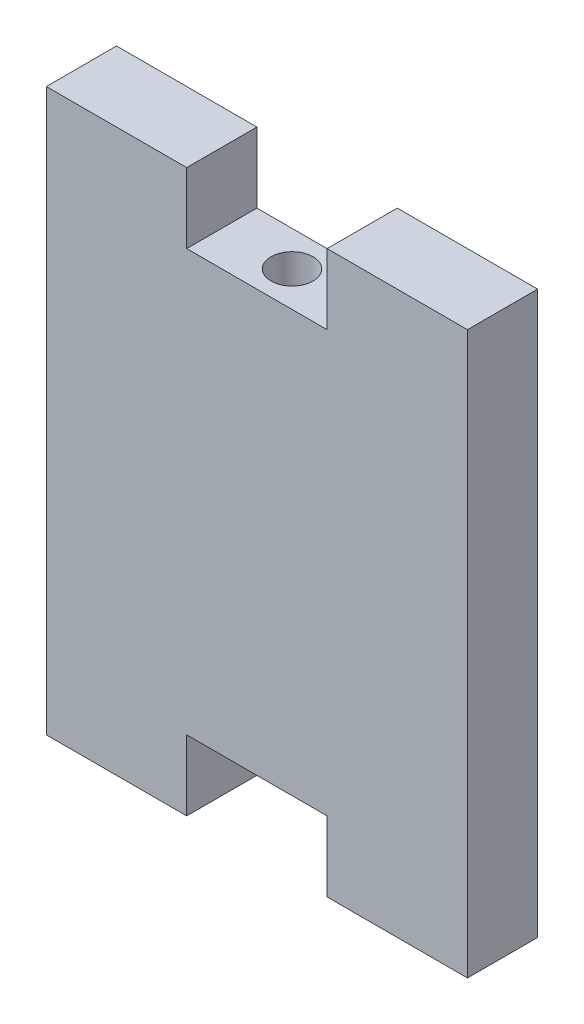
ISO-10303-21;
HEADER;
FILE_DESCRIPTION(('STEP AP214'),'2;1');
FILE_NAME('part.step','',(''),(''),'','','');
FILE_SCHEMA(('AUTOMOTIVE_DESIGN { 1 0 10303 214 1 1 1 1 }'));
ENDSEC;
DATA;
#1=APPLICATION_CONTEXT('core data for automotive mechanical design processes');
#2=APPLICATION_PROTOCOL_DEFINITION('international standard','automotive_design',2000,#1);
#3=PRODUCT_CONTEXT('',#1,'mechanical');
#4=PRODUCT('Part','Part','',(#3));
#5=PRODUCT_RELATED_PRODUCT_CATEGORY('part','',(#4));
#6=PRODUCT_DEFINITION_FORMATION('','',#4);
#7=PRODUCT_DEFINITION_CONTEXT('part definition',#1,'design');
#8=PRODUCT_DEFINITION('design','',#6,#7);
#9=PRODUCT_DEFINITION_SHAPE('','',#8);
#10=(LENGTH_UNIT() NAMED_UNIT(*) SI_UNIT(.MILLI.,.METRE.));
#11=(NAMED_UNIT(*) PLANE_ANGLE_UNIT() SI_UNIT($,.RADIAN.));
#12=(NAMED_UNIT(*) SI_UNIT($,.STERADIAN.) SOLID_ANGLE_UNIT());
#13=UNCERTAINTY_MEASURE_WITH_UNIT(LENGTH_MEASURE(1.E-05),#10,'distance_accuracy_value','');
#14=(GEOMETRIC_REPRESENTATION_CONTEXT(3) GLOBAL_UNCERTAINTY_ASSIGNED_CONTEXT((#13)) GLOBAL_UNIT_ASSIGNED_CONTEXT((#10,
#11,#12)) REPRESENTATION_CONTEXT('',''));
#15=CARTESIAN_POINT('',(0.,0.,0.));
#16=DIRECTION('',(0.,0.,1.));
#17=DIRECTION('',(1.,0.,0.));
#18=AXIS2_PLACEMENT_3D('',#15,#16,#17);
#19=CARTESIAN_POINT('',(30.,-40.,10.));
#20=DIRECTION('',(-1.,0.,0.));
#21=DIRECTION('',(0.,0.,1.));
#22=AXIS2_PLACEMENT_3D('',#19,#20,#21);
#23=PLANE('',#22);
#24=DIRECTION('',(0.,1.,0.));
#25=VECTOR('',#24,1.);
#26=CARTESIAN_POINT('',(30.,-40.,0.));
#27=LINE('',#26,#25);
#28=CARTESIAN_POINT('',(30.,-40.,0.));
#29=VERTEX_POINT('',#28);
#30=CARTESIAN_POINT('',(30.,40.,0.));
#31=VERTEX_POINT('',#30);
#32=EDGE_CURVE('E164',#29,#31,#27,.T.);
#33=ORIENTED_EDGE('',*,*,#32,.T.);
#34=DIRECTION('',(0.,0.,-1.));
#35=VECTOR('',#34,1.);
#36=CARTESIAN_POINT('',(30.,40.,10.));
#37=LINE('',#36,#35);
#38=CARTESIAN_POINT('',(30.,40.,10.));
#39=VERTEX_POINT('',#38);
#40=EDGE_CURVE('E11',#39,#31,#37,.T.);
#41=ORIENTED_EDGE('',*,*,#40,.F.);
#42=DIRECTION('',(0.,1.,0.));
#43=VECTOR('',#42,1.);
#44=CARTESIAN_POINT('',(30.,-40.,10.));
#45=LINE('',#44,#43);
#46=CARTESIAN_POINT('',(30.,-40.,10.));
#47=VERTEX_POINT('',#46);
#48=EDGE_CURVE('E198',#47,#39,#45,.T.);
#49=ORIENTED_EDGE('',*,*,#48,.F.);
#50=DIRECTION('',(0.,0.,-1.));
#51=VECTOR('',#50,1.);
#52=CARTESIAN_POINT('',(30.,-40.,10.));
#53=LINE('',#52,#51);
#54=EDGE_CURVE('E160',#47,#29,#53,.T.);
#55=ORIENTED_EDGE('',*,*,#54,.T.);
#56=EDGE_LOOP('',(#33,#41,#49,#55));
#57=FACE_BOUND('',#56,.T.);
#58=ADVANCED_FACE('F38',(#57),#23,.F.);
#59=CARTESIAN_POINT('',(10.,40.,10.));
#60=DIRECTION('',(0.,-1.,0.));
#61=DIRECTION('',(0.,0.,-1.));
#62=AXIS2_PLACEMENT_3D('',#59,#60,#61);
#63=PLANE('',#62);
#64=DIRECTION('',(-1.,0.,0.));
#65=VECTOR('',#64,1.);
#66=CARTESIAN_POINT('',(10.,40.,0.));
#67=LINE('',#66,#65);
#68=CARTESIAN_POINT('',(10.,40.,0.));
#69=VERTEX_POINT('',#68);
#70=EDGE_CURVE('E168',#31,#69,#67,.T.);
#71=ORIENTED_EDGE('',*,*,#70,.T.);
#72=DIRECTION('',(0.,0.,-1.));
#73=VECTOR('',#72,1.);
#74=CARTESIAN_POINT('',(10.,40.,10.));
#75=LINE('',#74,#73);
#76=CARTESIAN_POINT('',(10.,40.,10.));
#77=VERTEX_POINT('',#76);
#78=EDGE_CURVE('E48',#77,#69,#75,.T.);
#79=ORIENTED_EDGE('',*,*,#78,.F.);
#80=DIRECTION('',(-1.,0.,0.));
#81=VECTOR('',#80,1.);
#82=CARTESIAN_POINT('',(10.,40.,10.));
#83=LINE('',#82,#81);
#84=EDGE_CURVE('E111',#39,#77,#83,.T.);
#85=ORIENTED_EDGE('',*,*,#84,.F.);
#86=ORIENTED_EDGE('',*,*,#40,.T.);
#87=EDGE_LOOP('',(#71,#79,#85,#86));
#88=FACE_BOUND('',#87,.T.);
#89=ADVANCED_FACE('F293',(#88),#63,.F.);
#90=CARTESIAN_POINT('',(10.,40.,10.));
#91=DIRECTION('',(1.,0.,0.));
#92=DIRECTION('',(0.,0.,-1.));
#93=AXIS2_PLACEMENT_3D('',#90,#91,#92);
#94=PLANE('',#93);
#95=DIRECTION('',(0.,-1.,0.));
#96=VECTOR('',#95,1.);
#97=CARTESIAN_POINT('',(10.,40.,0.));
#98=LINE('',#97,#96);
#99=CARTESIAN_POINT('',(10.,30.,0.));
#100=VERTEX_POINT('',#99);
#101=EDGE_CURVE('E171',#69,#100,#98,.T.);
#102=ORIENTED_EDGE('',*,*,#101,.T.);
#103=DIRECTION('',(0.,0.,-1.));
#104=VECTOR('',#103,1.);
#105=CARTESIAN_POINT('',(10.,30.,10.));
#106=LINE('',#105,#104);
#107=CARTESIAN_POINT('',(10.,30.,10.));
#108=VERTEX_POINT('',#107);
#109=EDGE_CURVE('E225',#108,#100,#106,.T.);
#110=ORIENTED_EDGE('',*,*,#109,.F.);
#111=DIRECTION('',(0.,-1.,0.));
#112=VECTOR('',#111,1.);
#113=CARTESIAN_POINT('',(10.,40.,10.));
#114=LINE('',#113,#112);
#115=EDGE_CURVE('E236',#77,#108,#114,.T.);
#116=ORIENTED_EDGE('',*,*,#115,.F.);
#117=ORIENTED_EDGE('',*,*,#78,.T.);
#118=EDGE_LOOP('',(#102,#110,#116,#117));
#119=FACE_BOUND('',#118,.T.);
#120=ADVANCED_FACE('F234',(#119),#94,.F.);
#121=CARTESIAN_POINT('',(-10.,30.,10.));
#122=DIRECTION('',(0.,-1.,0.));
#123=DIRECTION('',(0.,0.,-1.));
#124=AXIS2_PLACEMENT_3D('',#121,#122,#123);
#125=PLANE('',#124);
#126=CARTESIAN_POINT('',(0.,30.,5.));
#127=DIRECTION('',(0.,1.,0.));
#128=DIRECTION('',(0.,0.,1.));
#129=AXIS2_PLACEMENT_3D('',#126,#127,#128);
#130=CIRCLE('',#129,3.);
#131=CARTESIAN_POINT('',(0.,30.,8.));
#132=VERTEX_POINT('',#131);
#133=EDGE_CURVE('E328',#132,#132,#130,.T.);
#134=ORIENTED_EDGE('',*,*,#133,.F.);
#135=EDGE_LOOP('',(#134));
#136=FACE_BOUND('',#135,.T.);
#137=DIRECTION('',(-1.,0.,0.));
#138=VECTOR('',#137,1.);
#139=CARTESIAN_POINT('',(-10.,30.,0.));
#140=LINE('',#139,#138);
#141=CARTESIAN_POINT('',(-10.,30.,0.));
#142=VERTEX_POINT('',#141);
#143=EDGE_CURVE('E174',#100,#142,#140,.T.);
#144=ORIENTED_EDGE('',*,*,#143,.T.);
#145=DIRECTION('',(0.,0.,-1.));
#146=VECTOR('',#145,1.);
#147=CARTESIAN_POINT('',(-10.,30.,10.));
#148=LINE('',#147,#146);
#149=CARTESIAN_POINT('',(-10.,30.,10.));
#150=VERTEX_POINT('',#149);
#151=EDGE_CURVE('E221',#150,#142,#148,.T.);
#152=ORIENTED_EDGE('',*,*,#151,.F.);
#153=DIRECTION('',(-1.,0.,0.));
#154=VECTOR('',#153,1.);
#155=CARTESIAN_POINT('',(-10.,30.,10.));
#156=LINE('',#155,#154);
#157=EDGE_CURVE('E255',#108,#150,#156,.T.);
#158=ORIENTED_EDGE('',*,*,#157,.F.);
#159=ORIENTED_EDGE('',*,*,#109,.T.);
#160=EDGE_LOOP('',(#144,#152,#158,#159));
#161=FACE_BOUND('',#160,.T.);
#162=ADVANCED_FACE('F245',(#136,#161),#125,.F.);
#163=CARTESIAN_POINT('',(-10.,40.,10.));
#164=DIRECTION('',(-1.,0.,0.));
#165=DIRECTION('',(0.,-1.,0.));
#166=AXIS2_PLACEMENT_3D('',#163,#164,#165);
#167=PLANE('',#166);
#168=DIRECTION('',(0.,1.,0.));
#169=VECTOR('',#168,1.);
#170=CARTESIAN_POINT('',(-10.,40.,0.));
#171=LINE('',#170,#169);
#172=CARTESIAN_POINT('',(-10.,40.,0.));
#173=VERTEX_POINT('',#172);
#174=EDGE_CURVE('E177',#142,#173,#171,.T.);
#175=ORIENTED_EDGE('',*,*,#174,.T.);
#176=DIRECTION('',(0.,0.,-1.));
#177=VECTOR('',#176,1.);
#178=CARTESIAN_POINT('',(-10.,40.,10.));
#179=LINE('',#178,#177);
#180=CARTESIAN_POINT('',(-10.,40.,10.));
#181=VERTEX_POINT('',#180);
#182=EDGE_CURVE('E217',#181,#173,#179,.T.);
#183=ORIENTED_EDGE('',*,*,#182,.F.);
#184=DIRECTION('',(0.,1.,0.));
#185=VECTOR('',#184,1.);
#186=CARTESIAN_POINT('',(-10.,40.,10.));
#187=LINE('',#186,#185);
#188=EDGE_CURVE('E251',#150,#181,#187,.T.);
#189=ORIENTED_EDGE('',*,*,#188,.F.);
#190=ORIENTED_EDGE('',*,*,#151,.T.);
#191=EDGE_LOOP('',(#175,#183,#189,#190));
#192=FACE_BOUND('',#191,.T.);
#193=ADVANCED_FACE('F249',(#192),#167,.F.);
#194=CARTESIAN_POINT('',(-30.,40.,10.));
#195=DIRECTION('',(0.,-1.,0.));
#196=DIRECTION('',(0.,0.,-1.));
#197=AXIS2_PLACEMENT_3D('',#194,#195,#196);
#198=PLANE('',#197);
#199=DIRECTION('',(-1.,0.,0.));
#200=VECTOR('',#199,1.);
#201=CARTESIAN_POINT('',(-30.,40.,0.));
#202=LINE('',#201,#200);
#203=CARTESIAN_POINT('',(-30.,40.,0.));
#204=VERTEX_POINT('',#203);
#205=EDGE_CURVE('E180',#173,#204,#202,.T.);
#206=ORIENTED_EDGE('',*,*,#205,.T.);
#207=DIRECTION('',(0.,0.,-1.));
#208=VECTOR('',#207,1.);
#209=CARTESIAN_POINT('',(-30.,40.,10.));
#210=LINE('',#209,#208);
#211=CARTESIAN_POINT('',(-30.,40.,10.));
#212=VERTEX_POINT('',#211);
#213=EDGE_CURVE('E213',#212,#204,#210,.T.);
#214=ORIENTED_EDGE('',*,*,#213,.F.);
#215=DIRECTION('',(-1.,0.,0.));
#216=VECTOR('',#215,1.);
#217=CARTESIAN_POINT('',(-30.,40.,10.));
#218=LINE('',#217,#216);
#219=EDGE_CURVE('E254',#181,#212,#218,.T.);
#220=ORIENTED_EDGE('',*,*,#219,.F.);
#221=ORIENTED_EDGE('',*,*,#182,.T.);
#222=EDGE_LOOP('',(#206,#214,#220,#221));
#223=FACE_BOUND('',#222,.T.);
#224=ADVANCED_FACE('F307',(#223),#198,.F.);
#225=CARTESIAN_POINT('',(-30.,-40.,10.));
#226=DIRECTION('',(1.,0.,0.));
#227=DIRECTION('',(0.,0.,-1.));
#228=AXIS2_PLACEMENT_3D('',#225,#226,#227);
#229=PLANE('',#228);
#230=DIRECTION('',(0.,-1.,0.));
#231=VECTOR('',#230,1.);
#232=CARTESIAN_POINT('',(-30.,-40.,0.));
#233=LINE('',#232,#231);
#234=CARTESIAN_POINT('',(-30.,-40.,0.));
#235=VERTEX_POINT('',#234);
#236=EDGE_CURVE('E183',#204,#235,#233,.T.);
#237=ORIENTED_EDGE('',*,*,#236,.T.);
#238=DIRECTION('',(0.,0.,-1.));
#239=VECTOR('',#238,1.);
#240=CARTESIAN_POINT('',(-30.,-40.,10.));
#241=LINE('',#240,#239);
#242=CARTESIAN_POINT('',(-30.,-40.,10.));
#243=VERTEX_POINT('',#242);
#244=EDGE_CURVE('E209',#243,#235,#241,.T.);
#245=ORIENTED_EDGE('',*,*,#244,.F.);
#246=DIRECTION('',(0.,-1.,0.));
#247=VECTOR('',#246,1.);
#248=CARTESIAN_POINT('',(-30.,-40.,10.));
#249=LINE('',#248,#247);
#250=EDGE_CURVE('E259',#212,#243,#249,.T.);
#251=ORIENTED_EDGE('',*,*,#250,.F.);
#252=ORIENTED_EDGE('',*,*,#213,.T.);
#253=EDGE_LOOP('',(#237,#245,#251,#252));
#254=FACE_BOUND('',#253,.T.);
#255=ADVANCED_FACE('F310',(#254),#229,.F.);
#256=CARTESIAN_POINT('',(-30.,-40.,10.));
#257=DIRECTION('',(0.,1.,0.));
#258=DIRECTION('',(-1.,0.,0.));
#259=AXIS2_PLACEMENT_3D('',#256,#257,#258);
#260=PLANE('',#259);
#261=DIRECTION('',(1.,0.,0.));
#262=VECTOR('',#261,1.);
#263=CARTESIAN_POINT('',(-30.,-40.,0.));
#264=LINE('',#263,#262);
#265=CARTESIAN_POINT('',(-9.99999999999999,-40.,0.));
#266=VERTEX_POINT('',#265);
#267=EDGE_CURVE('E186',#235,#266,#264,.T.);
#268=ORIENTED_EDGE('',*,*,#267,.T.);
#269=DIRECTION('',(0.,0.,-1.));
#270=VECTOR('',#269,1.);
#271=CARTESIAN_POINT('',(-9.99999999999999,-40.,10.));
#272=LINE('',#271,#270);
#273=CARTESIAN_POINT('',(-9.99999999999999,-40.,10.));
#274=VERTEX_POINT('',#273);
#275=EDGE_CURVE('E205',#274,#266,#272,.T.);
#276=ORIENTED_EDGE('',*,*,#275,.F.);
#277=DIRECTION('',(1.,0.,0.));
#278=VECTOR('',#277,1.);
#279=CARTESIAN_POINT('',(-30.,-40.,10.));
#280=LINE('',#279,#278);
#281=EDGE_CURVE('E266',#243,#274,#280,.T.);
#282=ORIENTED_EDGE('',*,*,#281,.F.);
#283=ORIENTED_EDGE('',*,*,#244,.T.);
#284=EDGE_LOOP('',(#268,#276,#282,#283));
#285=FACE_BOUND('',#284,.T.);
#286=ADVANCED_FACE('F274',(#285),#260,.F.);
#287=CARTESIAN_POINT('',(-9.99999999999999,-40.,10.));
#288=DIRECTION('',(-1.,0.,0.));
#289=DIRECTION('',(0.,-1.,0.));
#290=AXIS2_PLACEMENT_3D('',#287,#288,#289);
#291=PLANE('',#290);
#292=DIRECTION('',(0.,1.,0.));
#293=VECTOR('',#292,1.);
#294=CARTESIAN_POINT('',(-9.99999999999999,-40.,0.));
#295=LINE('',#294,#293);
#296=CARTESIAN_POINT('',(-10.,-30.,0.));
#297=VERTEX_POINT('',#296);
#298=EDGE_CURVE('E189',#266,#297,#295,.T.);
#299=ORIENTED_EDGE('',*,*,#298,.T.);
#300=DIRECTION('',(0.,0.,-1.));
#301=VECTOR('',#300,1.);
#302=CARTESIAN_POINT('',(-10.,-30.,10.));
#303=LINE('',#302,#301);
#304=CARTESIAN_POINT('',(-10.,-30.,10.));
#305=VERTEX_POINT('',#304);
#306=EDGE_CURVE('E153',#305,#297,#303,.T.);
#307=ORIENTED_EDGE('',*,*,#306,.F.);
#308=DIRECTION('',(0.,1.,0.));
#309=VECTOR('',#308,1.);
#310=CARTESIAN_POINT('',(-9.99999999999999,-40.,10.));
#311=LINE('',#310,#309);
#312=EDGE_CURVE('E142',#274,#305,#311,.T.);
#313=ORIENTED_EDGE('',*,*,#312,.F.);
#314=ORIENTED_EDGE('',*,*,#275,.T.);
#315=EDGE_LOOP('',(#299,#307,#313,#314));
#316=FACE_BOUND('',#315,.T.);
#317=ADVANCED_FACE('F278',(#316),#291,.F.);
#318=CARTESIAN_POINT('',(-10.,-30.,10.));
#319=DIRECTION('',(0.,1.,0.));
#320=DIRECTION('',(0.,0.,1.));
#321=AXIS2_PLACEMENT_3D('',#318,#319,#320);
#322=PLANE('',#321);
#323=CARTESIAN_POINT('',(0.,-30.,5.));
#324=DIRECTION('',(0.,1.,0.));
#325=DIRECTION('',(0.,0.,1.));
#326=AXIS2_PLACEMENT_3D('',#323,#324,#325);
#327=CIRCLE('',#326,3.);
#328=CARTESIAN_POINT('',(0.,-30.,8.));
#329=VERTEX_POINT('',#328);
#330=EDGE_CURVE('E41',#329,#329,#327,.T.);
#331=ORIENTED_EDGE('',*,*,#330,.T.);
#332=EDGE_LOOP('',(#331));
#333=FACE_BOUND('',#332,.T.);
#334=DIRECTION('',(1.,0.,0.));
#335=VECTOR('',#334,1.);
#336=CARTESIAN_POINT('',(-10.,-30.,0.));
#337=LINE('',#336,#335);
#338=CARTESIAN_POINT('',(10.,-30.,0.));
#339=VERTEX_POINT('',#338);
#340=EDGE_CURVE('E151',#297,#339,#337,.T.);
#341=ORIENTED_EDGE('',*,*,#340,.T.);
#342=DIRECTION('',(0.,0.,-1.));
#343=VECTOR('',#342,1.);
#344=CARTESIAN_POINT('',(10.,-30.,10.));
#345=LINE('',#344,#343);
#346=CARTESIAN_POINT('',(10.,-30.,10.));
#347=VERTEX_POINT('',#346);
#348=EDGE_CURVE('E148',#347,#339,#345,.T.);
#349=ORIENTED_EDGE('',*,*,#348,.F.);
#350=DIRECTION('',(1.,0.,0.));
#351=VECTOR('',#350,1.);
#352=CARTESIAN_POINT('',(-10.,-30.,10.));
#353=LINE('',#352,#351);
#354=EDGE_CURVE('E136',#305,#347,#353,.T.);
#355=ORIENTED_EDGE('',*,*,#354,.F.);
#356=ORIENTED_EDGE('',*,*,#306,.T.);
#357=EDGE_LOOP('',(#341,#349,#355,#356));
#358=FACE_BOUND('',#357,.T.);
#359=ADVANCED_FACE('F149',(#333,#358),#322,.F.);
#360=CARTESIAN_POINT('',(10.,-40.,10.));
#361=DIRECTION('',(1.,0.,0.));
#362=DIRECTION('',(0.,1.,0.));
#363=AXIS2_PLACEMENT_3D('',#360,#361,#362);
#364=PLANE('',#363);
#365=DIRECTION('',(0.,-1.,0.));
#366=VECTOR('',#365,1.);
#367=CARTESIAN_POINT('',(10.,-40.,0.));
#368=LINE('',#367,#366);
#369=CARTESIAN_POINT('',(10.,-40.,0.));
#370=VERTEX_POINT('',#369);
#371=EDGE_CURVE('E97',#339,#370,#368,.T.);
#372=ORIENTED_EDGE('',*,*,#371,.T.);
#373=DIRECTION('',(0.,0.,-1.));
#374=VECTOR('',#373,1.);
#375=CARTESIAN_POINT('',(10.,-40.,10.));
#376=LINE('',#375,#374);
#377=CARTESIAN_POINT('',(10.,-40.,10.));
#378=VERTEX_POINT('',#377);
#379=EDGE_CURVE('E154',#378,#370,#376,.T.);
#380=ORIENTED_EDGE('',*,*,#379,.F.);
#381=DIRECTION('',(0.,-1.,0.));
#382=VECTOR('',#381,1.);
#383=CARTESIAN_POINT('',(10.,-40.,10.));
#384=LINE('',#383,#382);
#385=EDGE_CURVE('E140',#347,#378,#384,.T.);
#386=ORIENTED_EDGE('',*,*,#385,.F.);
#387=ORIENTED_EDGE('',*,*,#348,.T.);
#388=EDGE_LOOP('',(#372,#380,#386,#387));
#389=FACE_BOUND('',#388,.T.);
#390=ADVANCED_FACE('F156',(#389),#364,.F.);
#391=CARTESIAN_POINT('',(10.,-40.,10.));
#392=DIRECTION('',(0.,1.,0.));
#393=DIRECTION('',(-1.,0.,0.));
#394=AXIS2_PLACEMENT_3D('',#391,#392,#393);
#395=PLANE('',#394);
#396=DIRECTION('',(1.,0.,0.));
#397=VECTOR('',#396,1.);
#398=CARTESIAN_POINT('',(10.,-40.,0.));
#399=LINE('',#398,#397);
#400=EDGE_CURVE('E103',#370,#29,#399,.T.);
#401=ORIENTED_EDGE('',*,*,#400,.T.);
#402=ORIENTED_EDGE('',*,*,#54,.F.);
#403=DIRECTION('',(1.,0.,0.));
#404=VECTOR('',#403,1.);
#405=CARTESIAN_POINT('',(10.,-40.,10.));
#406=LINE('',#405,#404);
#407=EDGE_CURVE('E56',#378,#47,#406,.T.);
#408=ORIENTED_EDGE('',*,*,#407,.F.);
#409=ORIENTED_EDGE('',*,*,#379,.T.);
#410=EDGE_LOOP('',(#401,#402,#408,#409));
#411=FACE_BOUND('',#410,.T.);
#412=ADVANCED_FACE('F282',(#411),#395,.F.);
#413=CARTESIAN_POINT('',(0.,0.,10.));
#414=DIRECTION('',(0.,0.,-1.));
#415=DIRECTION('',(-1.,0.,0.));
#416=AXIS2_PLACEMENT_3D('',#413,#414,#415);
#417=PLANE('',#416);
#418=ORIENTED_EDGE('',*,*,#48,.T.);
#419=ORIENTED_EDGE('',*,*,#84,.T.);
#420=ORIENTED_EDGE('',*,*,#115,.T.);
#421=ORIENTED_EDGE('',*,*,#157,.T.);
#422=ORIENTED_EDGE('',*,*,#188,.T.);
#423=ORIENTED_EDGE('',*,*,#219,.T.);
#424=ORIENTED_EDGE('',*,*,#250,.T.);
#425=ORIENTED_EDGE('',*,*,#281,.T.);
#426=ORIENTED_EDGE('',*,*,#312,.T.);
#427=ORIENTED_EDGE('',*,*,#354,.T.);
#428=ORIENTED_EDGE('',*,*,#385,.T.);
#429=ORIENTED_EDGE('',*,*,#407,.T.);
#430=EDGE_LOOP('',(#418,#419,#420,#421,#422,#423,#424,#425,#426,#427,#428,#429));
#431=FACE_BOUND('',#430,.T.);
#432=ADVANCED_FACE('F138',(#431),#417,.F.);
#433=CARTESIAN_POINT('',(0.,0.,0.));
#434=DIRECTION('',(0.,0.,-1.));
#435=DIRECTION('',(-1.,0.,0.));
#436=AXIS2_PLACEMENT_3D('',#433,#434,#435);
#437=PLANE('',#436);
#438=ORIENTED_EDGE('',*,*,#32,.F.);
#439=ORIENTED_EDGE('',*,*,#400,.F.);
#440=ORIENTED_EDGE('',*,*,#371,.F.);
#441=ORIENTED_EDGE('',*,*,#340,.F.);
#442=ORIENTED_EDGE('',*,*,#298,.F.);
#443=ORIENTED_EDGE('',*,*,#267,.F.);
#444=ORIENTED_EDGE('',*,*,#236,.F.);
#445=ORIENTED_EDGE('',*,*,#205,.F.);
#446=ORIENTED_EDGE('',*,*,#174,.F.);
#447=ORIENTED_EDGE('',*,*,#143,.F.);
#448=ORIENTED_EDGE('',*,*,#101,.F.);
#449=ORIENTED_EDGE('',*,*,#70,.F.);
#450=EDGE_LOOP('',(#438,#439,#440,#441,#442,#443,#444,#445,#446,#447,#448,#449));
#451=FACE_BOUND('',#450,.T.);
#452=ADVANCED_FACE('F240',(#451),#437,.T.);
#453=CARTESIAN_POINT('',(0.,-40.,5.));
#454=DIRECTION('',(0.,1.,0.));
#455=DIRECTION('',(0.,0.,1.));
#456=AXIS2_PLACEMENT_3D('',#453,#454,#455);
#457=CYLINDRICAL_SURFACE('',#456,3.);
#458=ORIENTED_EDGE('',*,*,#133,.T.);
#459=EDGE_LOOP('',(#458));
#460=FACE_BOUND('',#459,.T.);
#461=ORIENTED_EDGE('',*,*,#330,.F.);
#462=EDGE_LOOP('',(#461));
#463=FACE_BOUND('',#462,.T.);
#464=ADVANCED_FACE('F339',(#460,#463),#457,.F.);
#465=CLOSED_SHELL('',(#58,#89,#120,#162,#193,#224,#255,#286,#317,#359,#390,#412,#432,#452,#464));
#466=MANIFOLD_SOLID_BREP('B2',#465);
#467=ADVANCED_BREP_SHAPE_REPRESENTATION('',(#18,#466),#14);
#468=SHAPE_DEFINITION_REPRESENTATION(#9,#467);
ENDSEC;
END-ISO-10303-21;
